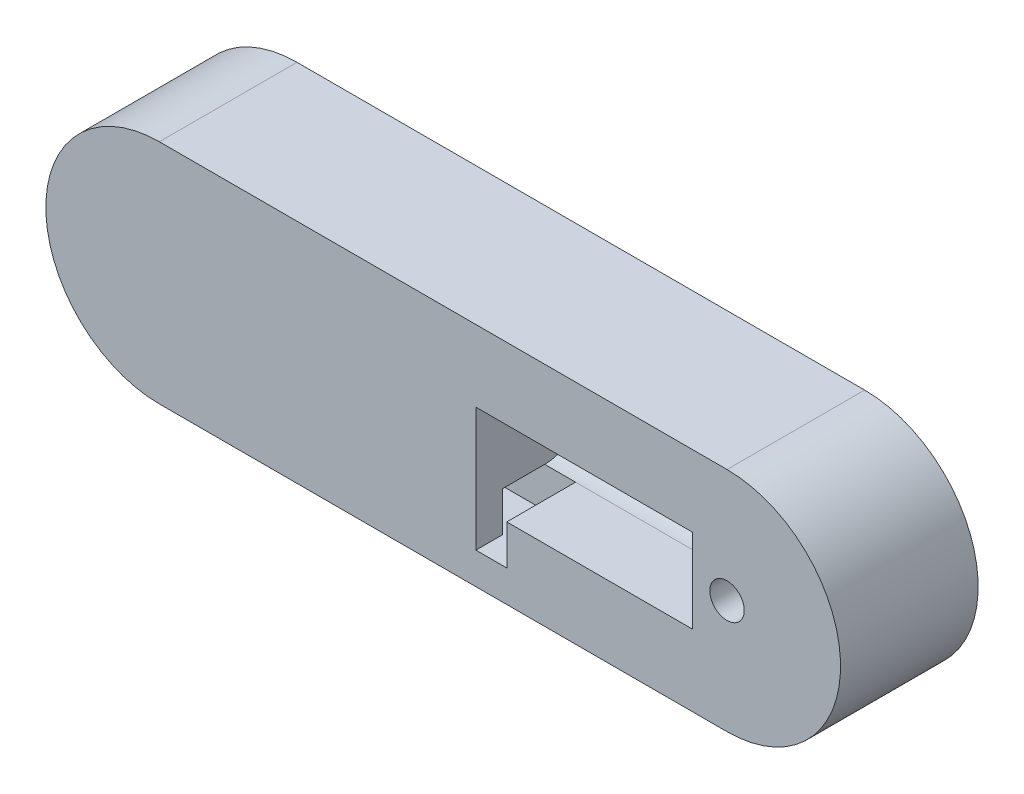
ISO-10303-21;
HEADER;
FILE_DESCRIPTION(('STEP AP214'),'2;1');
FILE_NAME('part.step','',(''),(''),'','','');
FILE_SCHEMA(('AUTOMOTIVE_DESIGN { 1 0 10303 214 1 1 1 1 }'));
ENDSEC;
DATA;
#1=APPLICATION_CONTEXT('core data for automotive mechanical design processes');
#2=APPLICATION_PROTOCOL_DEFINITION('international standard','automotive_design',2000,#1);
#3=PRODUCT_CONTEXT('',#1,'mechanical');
#4=PRODUCT('Part','Part','',(#3));
#5=PRODUCT_RELATED_PRODUCT_CATEGORY('part','',(#4));
#6=PRODUCT_DEFINITION_FORMATION('','',#4);
#7=PRODUCT_DEFINITION_CONTEXT('part definition',#1,'design');
#8=PRODUCT_DEFINITION('design','',#6,#7);
#9=PRODUCT_DEFINITION_SHAPE('','',#8);
#10=(LENGTH_UNIT() NAMED_UNIT(*) SI_UNIT(.MILLI.,.METRE.));
#11=(NAMED_UNIT(*) PLANE_ANGLE_UNIT() SI_UNIT($,.RADIAN.));
#12=(NAMED_UNIT(*) SI_UNIT($,.STERADIAN.) SOLID_ANGLE_UNIT());
#13=UNCERTAINTY_MEASURE_WITH_UNIT(LENGTH_MEASURE(1.E-05),#10,'distance_accuracy_value','');
#14=(GEOMETRIC_REPRESENTATION_CONTEXT(3) GLOBAL_UNCERTAINTY_ASSIGNED_CONTEXT((#13)) GLOBAL_UNIT_ASSIGNED_CONTEXT((#10,
#11,#12)) REPRESENTATION_CONTEXT('',''));
#15=CARTESIAN_POINT('',(0.,0.,0.));
#16=DIRECTION('',(0.,0.,1.));
#17=DIRECTION('',(1.,0.,0.));
#18=AXIS2_PLACEMENT_3D('',#15,#16,#17);
#19=CARTESIAN_POINT('',(0.,0.,20.));
#20=DIRECTION('',(0.,0.,1.));
#21=DIRECTION('',(1.,0.,0.));
#22=AXIS2_PLACEMENT_3D('',#19,#20,#21);
#23=PLANE('',#22);
#24=DIRECTION('',(1.,0.,0.));
#25=VECTOR('',#24,1.);
#26=CARTESIAN_POINT('',(-36.0271109618936,-12.2,20.));
#27=LINE('',#26,#25);
#28=CARTESIAN_POINT('',(-24.4271109618936,-12.2,20.));
#29=VERTEX_POINT('',#28);
#30=CARTESIAN_POINT('',(48.9728890381065,-12.2,20.));
#31=VERTEX_POINT('',#30);
#32=EDGE_CURVE('E247',#29,#31,#27,.T.);
#33=ORIENTED_EDGE('',*,*,#32,.F.);
#34=DIRECTION('',(0.,-1.,0.));
#35=VECTOR('',#34,1.);
#36=CARTESIAN_POINT('',(-24.4271109618936,-23.8,20.));
#37=LINE('',#36,#35);
#38=CARTESIAN_POINT('',(-24.4271109618936,-23.7999999999999,20.));
#39=VERTEX_POINT('',#38);
#40=EDGE_CURVE('E213',#29,#39,#37,.T.);
#41=ORIENTED_EDGE('',*,*,#40,.T.);
#42=DIRECTION('',(1.,0.,0.));
#43=VECTOR('',#42,1.);
#44=CARTESIAN_POINT('',(0.,-23.7999999999999,20.));
#45=LINE('',#44,#43);
#46=CARTESIAN_POINT('',(57.9484931674774,-23.8,20.));
#47=VERTEX_POINT('',#46);
#48=EDGE_CURVE('E209',#39,#47,#45,.T.);
#49=ORIENTED_EDGE('',*,*,#48,.T.);
#50=DIRECTION('',(0.,1.,0.));
#51=VECTOR('',#50,1.);
#52=CARTESIAN_POINT('',(57.9484931674774,0.,20.));
#53=LINE('',#52,#51);
#54=CARTESIAN_POINT('',(57.9484931674774,-12.2,20.));
#55=VERTEX_POINT('',#54);
#56=EDGE_CURVE('E329',#47,#55,#53,.T.);
#57=ORIENTED_EDGE('',*,*,#56,.T.);
#58=DIRECTION('',(-1.,0.,0.));
#59=VECTOR('',#58,1.);
#60=CARTESIAN_POINT('',(152.373384084578,-12.2,20.));
#61=LINE('',#60,#59);
#62=EDGE_CURVE('E449',#55,#31,#61,.T.);
#63=ORIENTED_EDGE('',*,*,#62,.T.);
#64=EDGE_LOOP('',(#33,#41,#49,#57,#63));
#65=FACE_BOUND('',#64,.T.);
#66=ADVANCED_FACE('F55',(#65),#23,.T.);
#67=CARTESIAN_POINT('',(48.9728890381065,0.,20.));
#68=DIRECTION('',(-1.,0.,0.));
#69=DIRECTION('',(0.,-1.,0.));
#70=AXIS2_PLACEMENT_3D('',#67,#68,#69);
#71=PLANE('',#70);
#72=DIRECTION('',(0.,0.,1.));
#73=VECTOR('',#72,1.);
#74=CARTESIAN_POINT('',(48.9728890381065,-12.2,0.));
#75=LINE('',#74,#73);
#76=CARTESIAN_POINT('',(48.9728890381065,-12.2,32.2));
#77=VERTEX_POINT('',#76);
#78=EDGE_CURVE('E216',#31,#77,#75,.T.);
#79=ORIENTED_EDGE('',*,*,#78,.F.);
#80=CARTESIAN_POINT('',(48.9728890381065,0.,20.));
#81=DIRECTION('',(1.,0.,0.));
#82=DIRECTION('',(0.,1.,0.));
#83=AXIS2_PLACEMENT_3D('',#80,#81,#82);
#84=CIRCLE('',#83,12.2);
#85=CARTESIAN_POINT('',(48.9728890381065,12.2,20.));
#86=VERTEX_POINT('',#85);
#87=EDGE_CURVE('E312',#31,#86,#84,.T.);
#88=ORIENTED_EDGE('',*,*,#87,.T.);
#89=DIRECTION('',(0.,0.,1.));
#90=VECTOR('',#89,1.);
#91=CARTESIAN_POINT('',(48.9728890381065,12.2,20.));
#92=LINE('',#91,#90);
#93=CARTESIAN_POINT('',(48.9728890381065,12.2,40.));
#94=VERTEX_POINT('',#93);
#95=EDGE_CURVE('E375',#86,#94,#92,.T.);
#96=ORIENTED_EDGE('',*,*,#95,.T.);
#97=DIRECTION('',(0.,-1.,0.));
#98=VECTOR('',#97,1.);
#99=CARTESIAN_POINT('',(48.9728890381065,0.,40.));
#100=LINE('',#99,#98);
#101=CARTESIAN_POINT('',(48.9728890381065,-23.8,40.));
#102=VERTEX_POINT('',#101);
#103=EDGE_CURVE('E344',#94,#102,#100,.T.);
#104=ORIENTED_EDGE('',*,*,#103,.T.);
#105=DIRECTION('',(0.,0.,1.));
#106=VECTOR('',#105,1.);
#107=CARTESIAN_POINT('',(48.9728890381065,-23.8,20.));
#108=LINE('',#107,#106);
#109=CARTESIAN_POINT('',(48.9728890381065,-23.8,32.2));
#110=VERTEX_POINT('',#109);
#111=EDGE_CURVE('E367',#110,#102,#108,.T.);
#112=ORIENTED_EDGE('',*,*,#111,.F.);
#113=DIRECTION('',(0.,-1.,0.));
#114=VECTOR('',#113,1.);
#115=CARTESIAN_POINT('',(48.9728890381065,0.,32.2));
#116=LINE('',#115,#114);
#117=EDGE_CURVE('E239',#77,#110,#116,.T.);
#118=ORIENTED_EDGE('',*,*,#117,.F.);
#119=EDGE_LOOP('',(#79,#88,#96,#104,#112,#118));
#120=FACE_BOUND('',#119,.T.);
#121=ADVANCED_FACE('F476',(#120),#71,.F.);
#122=CARTESIAN_POINT('',(121.972889038106,0.,40.));
#123=DIRECTION('',(0.,0.,-1.));
#124=DIRECTION('',(-1.,0.,0.));
#125=AXIS2_PLACEMENT_3D('',#122,#123,#124);
#126=CYLINDRICAL_SURFACE('',#125,4.99999999999999);
#127=CARTESIAN_POINT('',(121.972889038106,0.,0.));
#128=DIRECTION('',(0.,0.,1.));
#129=DIRECTION('',(1.,0.,0.));
#130=AXIS2_PLACEMENT_3D('',#127,#128,#129);
#131=CIRCLE('',#130,4.99999999999999);
#132=CARTESIAN_POINT('',(126.972889038106,0.,0.));
#133=VERTEX_POINT('',#132);
#134=EDGE_CURVE('E401',#133,#133,#131,.T.);
#135=ORIENTED_EDGE('',*,*,#134,.F.);
#136=EDGE_LOOP('',(#135));
#137=FACE_BOUND('',#136,.T.);
#138=CARTESIAN_POINT('',(121.972889038106,0.,7.80000000000001));
#139=DIRECTION('',(0.,0.,1.));
#140=DIRECTION('',(1.,0.,0.));
#141=AXIS2_PLACEMENT_3D('',#138,#139,#140);
#142=CIRCLE('',#141,4.99999999999999);
#143=CARTESIAN_POINT('',(126.972889038106,0.,7.80000000000001));
#144=VERTEX_POINT('',#143);
#145=EDGE_CURVE('E299',#144,#144,#142,.T.);
#146=ORIENTED_EDGE('',*,*,#145,.T.);
#147=EDGE_LOOP('',(#146));
#148=FACE_BOUND('',#147,.T.);
#149=ADVANCED_FACE('F547',(#137,#148),#126,.F.);
#150=CARTESIAN_POINT('',(111.972889038106,0.,20.));
#151=DIRECTION('',(1.,0.,0.));
#152=DIRECTION('',(0.,0.,-1.));
#153=AXIS2_PLACEMENT_3D('',#150,#151,#152);
#154=PLANE('',#153);
#155=DIRECTION('',(0.,1.,0.));
#156=VECTOR('',#155,1.);
#157=CARTESIAN_POINT('',(111.972889038106,0.,32.2));
#158=LINE('',#157,#156);
#159=CARTESIAN_POINT('',(111.972889038106,-12.2,32.2));
#160=VERTEX_POINT('',#159);
#161=CARTESIAN_POINT('',(111.972889038106,12.2,32.2));
#162=VERTEX_POINT('',#161);
#163=EDGE_CURVE('E284',#160,#162,#158,.T.);
#164=ORIENTED_EDGE('',*,*,#163,.F.);
#165=DIRECTION('',(0.,0.,1.));
#166=VECTOR('',#165,1.);
#167=CARTESIAN_POINT('',(111.972889038106,-12.2,20.));
#168=LINE('',#167,#166);
#169=CARTESIAN_POINT('',(111.972889038106,-12.2,40.));
#170=VERTEX_POINT('',#169);
#171=EDGE_CURVE('E360',#160,#170,#168,.T.);
#172=ORIENTED_EDGE('',*,*,#171,.T.);
#173=DIRECTION('',(0.,1.,0.));
#174=VECTOR('',#173,1.);
#175=CARTESIAN_POINT('',(111.972889038106,0.,40.));
#176=LINE('',#175,#174);
#177=CARTESIAN_POINT('',(111.972889038106,12.2,40.));
#178=VERTEX_POINT('',#177);
#179=EDGE_CURVE('E320',#170,#178,#176,.T.);
#180=ORIENTED_EDGE('',*,*,#179,.T.);
#181=DIRECTION('',(0.,0.,1.));
#182=VECTOR('',#181,1.);
#183=CARTESIAN_POINT('',(111.972889038106,12.2,20.));
#184=LINE('',#183,#182);
#185=EDGE_CURVE('E340',#162,#178,#184,.T.);
#186=ORIENTED_EDGE('',*,*,#185,.F.);
#187=EDGE_LOOP('',(#164,#172,#180,#186));
#188=FACE_BOUND('',#187,.T.);
#189=ADVANCED_FACE('F507',(#188),#154,.F.);
#190=CARTESIAN_POINT('',(0.,0.,0.));
#191=DIRECTION('',(0.,0.,1.));
#192=DIRECTION('',(1.,0.,0.));
#193=AXIS2_PLACEMENT_3D('',#190,#191,#192);
#194=PLANE('',#193);
#195=DIRECTION('',(1.,0.,0.));
#196=VECTOR('',#195,1.);
#197=CARTESIAN_POINT('',(-36.0271109618936,-12.2,0.));
#198=LINE('',#197,#196);
#199=CARTESIAN_POINT('',(-46.0271109618936,-12.2000000000001,0.));
#200=VERTEX_POINT('',#199);
#201=CARTESIAN_POINT('',(-24.4271109618936,-12.2,0.));
#202=VERTEX_POINT('',#201);
#203=EDGE_CURVE('E69',#200,#202,#198,.T.);
#204=ORIENTED_EDGE('',*,*,#203,.F.);
#205=DIRECTION('',(0.,-1.,0.));
#206=VECTOR('',#205,1.);
#207=CARTESIAN_POINT('',(-46.0271109618936,-23.8,0.));
#208=LINE('',#207,#206);
#209=CARTESIAN_POINT('',(-46.0271109618936,-23.8,0.));
#210=VERTEX_POINT('',#209);
#211=EDGE_CURVE('E223',#200,#210,#208,.T.);
#212=ORIENTED_EDGE('',*,*,#211,.T.);
#213=DIRECTION('',(-1.,0.,0.));
#214=VECTOR('',#213,1.);
#215=CARTESIAN_POINT('',(-24.4271109618936,-23.8,0.));
#216=LINE('',#215,#214);
#217=CARTESIAN_POINT('',(-24.4271109618936,-23.8,0.));
#218=VERTEX_POINT('',#217);
#219=EDGE_CURVE('E77',#218,#210,#216,.T.);
#220=ORIENTED_EDGE('',*,*,#219,.F.);
#221=DIRECTION('',(0.,-1.,0.));
#222=VECTOR('',#221,1.);
#223=CARTESIAN_POINT('',(-24.4271109618936,-23.8,0.));
#224=LINE('',#223,#222);
#225=EDGE_CURVE('E217',#202,#218,#224,.T.);
#226=ORIENTED_EDGE('',*,*,#225,.F.);
#227=EDGE_LOOP('',(#204,#212,#220,#226));
#228=FACE_BOUND('',#227,.T.);
#229=CARTESIAN_POINT('',(-43.0271109618936,0.,0.));
#230=DIRECTION('',(0.,0.,1.));
#231=DIRECTION('',(1.,0.,0.));
#232=AXIS2_PLACEMENT_3D('',#229,#230,#231);
#233=CIRCLE('',#232,33.);
#234=CARTESIAN_POINT('',(-43.0271109618936,33.,0.));
#235=VERTEX_POINT('',#234);
#236=CARTESIAN_POINT('',(-43.0271109618936,-33.,0.));
#237=VERTEX_POINT('',#236);
#238=EDGE_CURVE('E399',#235,#237,#233,.T.);
#239=ORIENTED_EDGE('',*,*,#238,.F.);
#240=DIRECTION('',(1.,0.,0.));
#241=VECTOR('',#240,1.);
#242=CARTESIAN_POINT('',(0.,33.,0.));
#243=LINE('',#242,#241);
#244=CARTESIAN_POINT('',(121.972889038106,33.,0.));
#245=VERTEX_POINT('',#244);
#246=EDGE_CURVE('E426',#235,#245,#243,.T.);
#247=ORIENTED_EDGE('',*,*,#246,.T.);
#248=CARTESIAN_POINT('',(121.972889038106,0.,0.));
#249=DIRECTION('',(0.,0.,1.));
#250=DIRECTION('',(1.,0.,0.));
#251=AXIS2_PLACEMENT_3D('',#248,#249,#250);
#252=CIRCLE('',#251,33.);
#253=CARTESIAN_POINT('',(121.972889038106,-33.,0.));
#254=VERTEX_POINT('',#253);
#255=EDGE_CURVE('E425',#254,#245,#252,.T.);
#256=ORIENTED_EDGE('',*,*,#255,.F.);
#257=DIRECTION('',(1.,0.,0.));
#258=VECTOR('',#257,1.);
#259=CARTESIAN_POINT('',(0.,-33.,0.));
#260=LINE('',#259,#258);
#261=EDGE_CURVE('E423',#237,#254,#260,.T.);
#262=ORIENTED_EDGE('',*,*,#261,.F.);
#263=EDGE_LOOP('',(#239,#247,#256,#262));
#264=FACE_BOUND('',#263,.T.);
#265=ORIENTED_EDGE('',*,*,#134,.T.);
#266=EDGE_LOOP('',(#265));
#267=FACE_BOUND('',#266,.T.);
#268=CARTESIAN_POINT('',(-43.0271109618936,0.,0.));
#269=DIRECTION('',(0.,0.,1.));
#270=DIRECTION('',(1.,0.,0.));
#271=AXIS2_PLACEMENT_3D('',#268,#269,#270);
#272=CIRCLE('',#271,2.);
#273=CARTESIAN_POINT('',(-41.5098899591176,1.3030888030888,0.));
#274=VERTEX_POINT('',#273);
#275=CARTESIAN_POINT('',(-41.5098899591176,-1.3030888030888,0.));
#276=VERTEX_POINT('',#275);
#277=EDGE_CURVE('E385',#274,#276,#272,.T.);
#278=ORIENTED_EDGE('',*,*,#277,.T.);
#279=DIRECTION('',(0.,-1.,0.));
#280=VECTOR('',#279,1.);
#281=CARTESIAN_POINT('',(-41.5098899591176,0.,0.));
#282=LINE('',#281,#280);
#283=EDGE_CURVE('E365',#274,#276,#282,.T.);
#284=ORIENTED_EDGE('',*,*,#283,.F.);
#285=EDGE_LOOP('',(#278,#284));
#286=FACE_BOUND('',#285,.T.);
#287=ADVANCED_FACE('F224',(#228,#264,#267,#286),#194,.F.);
#288=CARTESIAN_POINT('',(-43.0271109618936,0.,40.));
#289=DIRECTION('',(0.,0.,-1.));
#290=DIRECTION('',(-1.,0.,0.));
#291=AXIS2_PLACEMENT_3D('',#288,#289,#290);
#292=CYLINDRICAL_SURFACE('',#291,33.);
#293=ORIENTED_EDGE('',*,*,#238,.T.);
#294=DIRECTION('',(0.,0.,-1.));
#295=VECTOR('',#294,1.);
#296=CARTESIAN_POINT('',(-43.0271109618936,-33.,40.));
#297=LINE('',#296,#295);
#298=CARTESIAN_POINT('',(-43.0271109618936,-33.,40.));
#299=VERTEX_POINT('',#298);
#300=EDGE_CURVE('E443',#299,#237,#297,.T.);
#301=ORIENTED_EDGE('',*,*,#300,.F.);
#302=CARTESIAN_POINT('',(-43.0271109618936,0.,40.));
#303=DIRECTION('',(0.,0.,1.));
#304=DIRECTION('',(1.,0.,0.));
#305=AXIS2_PLACEMENT_3D('',#302,#303,#304);
#306=CIRCLE('',#305,33.);
#307=CARTESIAN_POINT('',(-43.0271109618936,33.,40.));
#308=VERTEX_POINT('',#307);
#309=EDGE_CURVE('E400',#308,#299,#306,.T.);
#310=ORIENTED_EDGE('',*,*,#309,.F.);
#311=DIRECTION('',(0.,0.,-1.));
#312=VECTOR('',#311,1.);
#313=CARTESIAN_POINT('',(-43.0271109618936,33.,40.));
#314=LINE('',#313,#312);
#315=EDGE_CURVE('E419',#308,#235,#314,.T.);
#316=ORIENTED_EDGE('',*,*,#315,.T.);
#317=EDGE_LOOP('',(#293,#301,#310,#316));
#318=FACE_BOUND('',#317,.T.);
#319=ADVANCED_FACE('F577',(#318),#292,.T.);
#320=CARTESIAN_POINT('',(0.,-33.,40.));
#321=DIRECTION('',(0.,1.,0.));
#322=DIRECTION('',(0.,0.,1.));
#323=AXIS2_PLACEMENT_3D('',#320,#321,#322);
#324=PLANE('',#323);
#325=ORIENTED_EDGE('',*,*,#261,.T.);
#326=DIRECTION('',(0.,0.,-1.));
#327=VECTOR('',#326,1.);
#328=CARTESIAN_POINT('',(121.972889038106,-33.,40.));
#329=LINE('',#328,#327);
#330=CARTESIAN_POINT('',(121.972889038106,-33.,40.));
#331=VERTEX_POINT('',#330);
#332=EDGE_CURVE('E439',#331,#254,#329,.T.);
#333=ORIENTED_EDGE('',*,*,#332,.F.);
#334=DIRECTION('',(1.,0.,0.));
#335=VECTOR('',#334,1.);
#336=CARTESIAN_POINT('',(0.,-33.,40.));
#337=LINE('',#336,#335);
#338=EDGE_CURVE('E405',#299,#331,#337,.T.);
#339=ORIENTED_EDGE('',*,*,#338,.F.);
#340=ORIENTED_EDGE('',*,*,#300,.T.);
#341=EDGE_LOOP('',(#325,#333,#339,#340));
#342=FACE_BOUND('',#341,.T.);
#343=ADVANCED_FACE('F590',(#342),#324,.F.);
#344=CARTESIAN_POINT('',(121.972889038106,0.,40.));
#345=DIRECTION('',(0.,0.,-1.));
#346=DIRECTION('',(-1.,0.,0.));
#347=AXIS2_PLACEMENT_3D('',#344,#345,#346);
#348=CYLINDRICAL_SURFACE('',#347,33.);
#349=ORIENTED_EDGE('',*,*,#255,.T.);
#350=DIRECTION('',(0.,0.,-1.));
#351=VECTOR('',#350,1.);
#352=CARTESIAN_POINT('',(121.972889038106,33.,40.));
#353=LINE('',#352,#351);
#354=CARTESIAN_POINT('',(121.972889038106,33.,40.));
#355=VERTEX_POINT('',#354);
#356=EDGE_CURVE('E440',#355,#245,#353,.T.);
#357=ORIENTED_EDGE('',*,*,#356,.F.);
#358=CARTESIAN_POINT('',(121.972889038106,0.,40.));
#359=DIRECTION('',(0.,0.,1.));
#360=DIRECTION('',(1.,0.,0.));
#361=AXIS2_PLACEMENT_3D('',#358,#359,#360);
#362=CIRCLE('',#361,33.);
#363=EDGE_CURVE('E406',#331,#355,#362,.T.);
#364=ORIENTED_EDGE('',*,*,#363,.F.);
#365=ORIENTED_EDGE('',*,*,#332,.T.);
#366=EDGE_LOOP('',(#349,#357,#364,#365));
#367=FACE_BOUND('',#366,.T.);
#368=ADVANCED_FACE('F582',(#367),#348,.T.);
#369=CARTESIAN_POINT('',(0.,33.,40.));
#370=DIRECTION('',(0.,1.,0.));
#371=DIRECTION('',(0.,0.,1.));
#372=AXIS2_PLACEMENT_3D('',#369,#370,#371);
#373=PLANE('',#372);
#374=ORIENTED_EDGE('',*,*,#246,.F.);
#375=ORIENTED_EDGE('',*,*,#315,.F.);
#376=DIRECTION('',(1.,0.,0.));
#377=VECTOR('',#376,1.);
#378=CARTESIAN_POINT('',(0.,33.,40.));
#379=LINE('',#378,#377);
#380=EDGE_CURVE('E408',#308,#355,#379,.T.);
#381=ORIENTED_EDGE('',*,*,#380,.T.);
#382=ORIENTED_EDGE('',*,*,#356,.T.);
#383=EDGE_LOOP('',(#374,#375,#381,#382));
#384=FACE_BOUND('',#383,.T.);
#385=ADVANCED_FACE('F576',(#384),#373,.T.);
#386=CARTESIAN_POINT('',(121.972889038106,0.,32.2));
#387=DIRECTION('',(0.,0.,1.));
#388=DIRECTION('',(1.,0.,0.));
#389=AXIS2_PLACEMENT_3D('',#386,#387,#388);
#390=CIRCLE('',#389,4.99999999999999);
#391=CARTESIAN_POINT('',(126.972889038106,0.,32.2));
#392=VERTEX_POINT('',#391);
#393=EDGE_CURVE('E315',#392,#392,#390,.T.);
#394=ORIENTED_EDGE('',*,*,#393,.F.);
#395=EDGE_LOOP('',(#394));
#396=FACE_BOUND('',#395,.T.);
#397=CARTESIAN_POINT('',(121.972889038106,0.,40.));
#398=DIRECTION('',(0.,0.,1.));
#399=DIRECTION('',(1.,0.,0.));
#400=AXIS2_PLACEMENT_3D('',#397,#398,#399);
#401=CIRCLE('',#400,4.99999999999999);
#402=CARTESIAN_POINT('',(126.972889038106,0.,40.));
#403=VERTEX_POINT('',#402);
#404=EDGE_CURVE('E413',#403,#403,#401,.T.);
#405=ORIENTED_EDGE('',*,*,#404,.T.);
#406=EDGE_LOOP('',(#405));
#407=FACE_BOUND('',#406,.T.);
#408=ADVANCED_FACE('F572',(#396,#407),#126,.F.);
#409=CARTESIAN_POINT('',(0.,0.,40.));
#410=DIRECTION('',(0.,0.,1.));
#411=DIRECTION('',(1.,0.,0.));
#412=AXIS2_PLACEMENT_3D('',#409,#410,#411);
#413=PLANE('',#412);
#414=ORIENTED_EDGE('',*,*,#179,.F.);
#415=DIRECTION('',(1.,0.,0.));
#416=VECTOR('',#415,1.);
#417=CARTESIAN_POINT('',(0.,-12.2,40.));
#418=LINE('',#417,#416);
#419=CARTESIAN_POINT('',(57.9484931674774,-12.2,40.));
#420=VERTEX_POINT('',#419);
#421=EDGE_CURVE('E327',#420,#170,#418,.T.);
#422=ORIENTED_EDGE('',*,*,#421,.F.);
#423=DIRECTION('',(0.,1.,0.));
#424=VECTOR('',#423,1.);
#425=CARTESIAN_POINT('',(57.9484931674774,0.,40.));
#426=LINE('',#425,#424);
#427=CARTESIAN_POINT('',(57.9484931674774,-23.8,40.));
#428=VERTEX_POINT('',#427);
#429=EDGE_CURVE('E354',#428,#420,#426,.T.);
#430=ORIENTED_EDGE('',*,*,#429,.F.);
#431=DIRECTION('',(1.,0.,0.));
#432=VECTOR('',#431,1.);
#433=CARTESIAN_POINT('',(0.,-23.7999999999999,40.));
#434=LINE('',#433,#432);
#435=EDGE_CURVE('E349',#102,#428,#434,.T.);
#436=ORIENTED_EDGE('',*,*,#435,.F.);
#437=ORIENTED_EDGE('',*,*,#103,.F.);
#438=DIRECTION('',(-1.,0.,0.));
#439=VECTOR('',#438,1.);
#440=CARTESIAN_POINT('',(0.,12.2,40.));
#441=LINE('',#440,#439);
#442=EDGE_CURVE('E341',#178,#94,#441,.T.);
#443=ORIENTED_EDGE('',*,*,#442,.F.);
#444=EDGE_LOOP('',(#414,#422,#430,#436,#437,#443));
#445=FACE_BOUND('',#444,.T.);
#446=ORIENTED_EDGE('',*,*,#309,.T.);
#447=ORIENTED_EDGE('',*,*,#338,.T.);
#448=ORIENTED_EDGE('',*,*,#363,.T.);
#449=ORIENTED_EDGE('',*,*,#380,.F.);
#450=EDGE_LOOP('',(#446,#447,#448,#449));
#451=FACE_BOUND('',#450,.T.);
#452=ORIENTED_EDGE('',*,*,#404,.F.);
#453=EDGE_LOOP('',(#452));
#454=FACE_BOUND('',#453,.T.);
#455=ADVANCED_FACE('F483',(#445,#451,#454),#413,.T.);
#456=CARTESIAN_POINT('',(-41.5098899591176,0.,10.));
#457=DIRECTION('',(1.,0.,0.));
#458=DIRECTION('',(0.,0.,-1.));
#459=AXIS2_PLACEMENT_3D('',#456,#457,#458);
#460=PLANE('',#459);
#461=ORIENTED_EDGE('',*,*,#283,.T.);
#462=DIRECTION('',(0.,0.,-1.));
#463=VECTOR('',#462,1.);
#464=CARTESIAN_POINT('',(-41.5098899591176,-1.3030888030888,10.));
#465=LINE('',#464,#463);
#466=CARTESIAN_POINT('',(-41.5098899591176,-1.3030888030888,10.));
#467=VERTEX_POINT('',#466);
#468=EDGE_CURVE('E383',#467,#276,#465,.T.);
#469=ORIENTED_EDGE('',*,*,#468,.F.);
#470=DIRECTION('',(0.,-1.,0.));
#471=VECTOR('',#470,1.);
#472=CARTESIAN_POINT('',(-41.5098899591176,0.,10.));
#473=LINE('',#472,#471);
#474=CARTESIAN_POINT('',(-41.5098899591176,1.3030888030888,10.));
#475=VERTEX_POINT('',#474);
#476=EDGE_CURVE('E380',#475,#467,#473,.T.);
#477=ORIENTED_EDGE('',*,*,#476,.F.);
#478=DIRECTION('',(0.,0.,-1.));
#479=VECTOR('',#478,1.);
#480=CARTESIAN_POINT('',(-41.5098899591176,1.3030888030888,10.));
#481=LINE('',#480,#479);
#482=EDGE_CURVE('E394',#475,#274,#481,.T.);
#483=ORIENTED_EDGE('',*,*,#482,.T.);
#484=EDGE_LOOP('',(#461,#469,#477,#483));
#485=FACE_BOUND('',#484,.T.);
#486=ADVANCED_FACE('F566',(#485),#460,.F.);
#487=CARTESIAN_POINT('',(-43.0271109618936,0.,10.));
#488=DIRECTION('',(0.,0.,-1.));
#489=DIRECTION('',(-1.,0.,0.));
#490=AXIS2_PLACEMENT_3D('',#487,#488,#489);
#491=CYLINDRICAL_SURFACE('',#490,2.);
#492=ORIENTED_EDGE('',*,*,#277,.F.);
#493=ORIENTED_EDGE('',*,*,#482,.F.);
#494=CARTESIAN_POINT('',(-43.0271109618936,0.,10.));
#495=DIRECTION('',(0.,0.,1.));
#496=DIRECTION('',(1.,0.,0.));
#497=AXIS2_PLACEMENT_3D('',#494,#495,#496);
#498=CIRCLE('',#497,2.);
#499=EDGE_CURVE('E382',#475,#467,#498,.T.);
#500=ORIENTED_EDGE('',*,*,#499,.T.);
#501=ORIENTED_EDGE('',*,*,#468,.T.);
#502=EDGE_LOOP('',(#492,#493,#500,#501));
#503=FACE_BOUND('',#502,.T.);
#504=ADVANCED_FACE('F565',(#503),#491,.F.);
#505=CARTESIAN_POINT('',(0.,0.,10.));
#506=DIRECTION('',(0.,0.,1.));
#507=DIRECTION('',(1.,0.,0.));
#508=AXIS2_PLACEMENT_3D('',#505,#506,#507);
#509=PLANE('',#508);
#510=ORIENTED_EDGE('',*,*,#476,.T.);
#511=ORIENTED_EDGE('',*,*,#499,.F.);
#512=EDGE_LOOP('',(#510,#511));
#513=FACE_BOUND('',#512,.T.);
#514=ADVANCED_FACE('F552',(#513),#509,.F.);
#515=CARTESIAN_POINT('',(0.,-12.2,20.));
#516=DIRECTION('',(0.,-1.,0.));
#517=DIRECTION('',(0.,0.,-1.));
#518=AXIS2_PLACEMENT_3D('',#515,#516,#517);
#519=PLANE('',#518);
#520=ORIENTED_EDGE('',*,*,#421,.T.);
#521=ORIENTED_EDGE('',*,*,#171,.F.);
#522=DIRECTION('',(-1.,0.,0.));
#523=VECTOR('',#522,1.);
#524=CARTESIAN_POINT('',(141.972889038106,-12.2,32.2));
#525=LINE('',#524,#523);
#526=CARTESIAN_POINT('',(141.972889038106,-12.2,32.2));
#527=VERTEX_POINT('',#526);
#528=EDGE_CURVE('E279',#527,#160,#525,.T.);
#529=ORIENTED_EDGE('',*,*,#528,.F.);
#530=DIRECTION('',(0.,0.,1.));
#531=VECTOR('',#530,1.);
#532=CARTESIAN_POINT('',(141.972889038106,-12.2,0.));
#533=LINE('',#532,#531);
#534=CARTESIAN_POINT('',(141.972889038106,-12.2,7.80000000000001));
#535=VERTEX_POINT('',#534);
#536=EDGE_CURVE('E264',#535,#527,#533,.T.);
#537=ORIENTED_EDGE('',*,*,#536,.F.);
#538=DIRECTION('',(-1.,0.,0.));
#539=VECTOR('',#538,1.);
#540=CARTESIAN_POINT('',(141.972889038106,-12.2,7.80000000000001));
#541=LINE('',#540,#539);
#542=CARTESIAN_POINT('',(111.972889038106,-12.2,7.80000000000001));
#543=VERTEX_POINT('',#542);
#544=EDGE_CURVE('E298',#535,#543,#541,.T.);
#545=ORIENTED_EDGE('',*,*,#544,.T.);
#546=DIRECTION('',(0.,0.,1.));
#547=VECTOR('',#546,1.);
#548=CARTESIAN_POINT('',(111.972889038106,-12.2,0.));
#549=LINE('',#548,#547);
#550=CARTESIAN_POINT('',(111.972889038106,-12.2,20.));
#551=VERTEX_POINT('',#550);
#552=EDGE_CURVE('E260',#543,#551,#549,.T.);
#553=ORIENTED_EDGE('',*,*,#552,.T.);
#554=DIRECTION('',(1.,0.,0.));
#555=VECTOR('',#554,1.);
#556=CARTESIAN_POINT('',(0.,-12.2,20.));
#557=LINE('',#556,#555);
#558=EDGE_CURVE('E335',#55,#551,#557,.T.);
#559=ORIENTED_EDGE('',*,*,#558,.F.);
#560=DIRECTION('',(0.,0.,1.));
#561=VECTOR('',#560,1.);
#562=CARTESIAN_POINT('',(57.9484931674774,-12.2,20.));
#563=LINE('',#562,#561);
#564=EDGE_CURVE('E361',#55,#420,#563,.T.);
#565=ORIENTED_EDGE('',*,*,#564,.T.);
#566=EDGE_LOOP('',(#520,#521,#529,#537,#545,#553,#559,#565));
#567=FACE_BOUND('',#566,.T.);
#568=ADVANCED_FACE('F496',(#567),#519,.F.);
#569=CARTESIAN_POINT('',(57.9484931674774,0.,20.));
#570=DIRECTION('',(1.,0.,0.));
#571=DIRECTION('',(0.,1.,0.));
#572=AXIS2_PLACEMENT_3D('',#569,#570,#571);
#573=PLANE('',#572);
#574=ORIENTED_EDGE('',*,*,#429,.T.);
#575=ORIENTED_EDGE('',*,*,#564,.F.);
#576=ORIENTED_EDGE('',*,*,#56,.F.);
#577=DIRECTION('',(0.,0.,1.));
#578=VECTOR('',#577,1.);
#579=CARTESIAN_POINT('',(57.9484931674774,-23.8,20.));
#580=LINE('',#579,#578);
#581=EDGE_CURVE('E366',#47,#428,#580,.T.);
#582=ORIENTED_EDGE('',*,*,#581,.T.);
#583=EDGE_LOOP('',(#574,#575,#576,#582));
#584=FACE_BOUND('',#583,.T.);
#585=ADVANCED_FACE('F489',(#584),#573,.F.);
#586=CARTESIAN_POINT('',(0.,-23.7999999999999,20.));
#587=DIRECTION('',(0.,-1.,0.));
#588=DIRECTION('',(1.,0.,0.));
#589=AXIS2_PLACEMENT_3D('',#586,#587,#588);
#590=PLANE('',#589);
#591=ORIENTED_EDGE('',*,*,#435,.T.);
#592=ORIENTED_EDGE('',*,*,#581,.F.);
#593=ORIENTED_EDGE('',*,*,#48,.F.);
#594=DIRECTION('',(0.,0.,-1.));
#595=VECTOR('',#594,1.);
#596=CARTESIAN_POINT('',(-24.4271109618936,-23.8,40.001));
#597=LINE('',#596,#595);
#598=EDGE_CURVE('E201',#39,#218,#597,.T.);
#599=ORIENTED_EDGE('',*,*,#598,.T.);
#600=ORIENTED_EDGE('',*,*,#219,.T.);
#601=DIRECTION('',(0.70710678118655,0.,0.707106781186546));
#602=VECTOR('',#601,1.);
#603=CARTESIAN_POINT('',(-13.0135554809467,-23.7999999999999,33.0135554809467));
#604=LINE('',#603,#602);
#605=CARTESIAN_POINT('',(-36.0271109618935,-23.8,9.99999999999998));
#606=VERTEX_POINT('',#605);
#607=EDGE_CURVE('E12',#210,#606,#604,.T.);
#608=ORIENTED_EDGE('',*,*,#607,.T.);
#609=DIRECTION('',(0.,0.,-1.));
#610=VECTOR('',#609,1.);
#611=CARTESIAN_POINT('',(-36.0271109618935,-23.8,0.));
#612=LINE('',#611,#610);
#613=CARTESIAN_POINT('',(-36.0271109618935,-23.8,32.2));
#614=VERTEX_POINT('',#613);
#615=EDGE_CURVE('E242',#614,#606,#612,.T.);
#616=ORIENTED_EDGE('',*,*,#615,.F.);
#617=DIRECTION('',(1.,0.,0.));
#618=VECTOR('',#617,1.);
#619=CARTESIAN_POINT('',(-36.0271109618935,-23.8,32.2));
#620=LINE('',#619,#618);
#621=EDGE_CURVE('E251',#614,#110,#620,.T.);
#622=ORIENTED_EDGE('',*,*,#621,.T.);
#623=ORIENTED_EDGE('',*,*,#111,.T.);
#624=EDGE_LOOP('',(#591,#592,#593,#599,#600,#608,#616,#622,#623));
#625=FACE_BOUND('',#624,.T.);
#626=ADVANCED_FACE('F210',(#625),#590,.F.);
#627=CARTESIAN_POINT('',(0.,12.2,20.));
#628=DIRECTION('',(0.,1.,0.));
#629=DIRECTION('',(0.,0.,1.));
#630=AXIS2_PLACEMENT_3D('',#627,#628,#629);
#631=PLANE('',#630);
#632=ORIENTED_EDGE('',*,*,#442,.T.);
#633=ORIENTED_EDGE('',*,*,#95,.F.);
#634=DIRECTION('',(-1.,0.,0.));
#635=VECTOR('',#634,1.);
#636=CARTESIAN_POINT('',(0.,12.2,20.));
#637=LINE('',#636,#635);
#638=CARTESIAN_POINT('',(111.972889038106,12.2,20.));
#639=VERTEX_POINT('',#638);
#640=EDGE_CURVE('E322',#639,#86,#637,.T.);
#641=ORIENTED_EDGE('',*,*,#640,.F.);
#642=DIRECTION('',(0.,0.,-1.));
#643=VECTOR('',#642,1.);
#644=CARTESIAN_POINT('',(111.972889038106,12.2,0.));
#645=LINE('',#644,#643);
#646=CARTESIAN_POINT('',(111.972889038106,12.2,7.80000000000001));
#647=VERTEX_POINT('',#646);
#648=EDGE_CURVE('E290',#639,#647,#645,.T.);
#649=ORIENTED_EDGE('',*,*,#648,.T.);
#650=DIRECTION('',(-1.,0.,0.));
#651=VECTOR('',#650,1.);
#652=CARTESIAN_POINT('',(141.972889038106,12.2,7.80000000000001));
#653=LINE('',#652,#651);
#654=CARTESIAN_POINT('',(141.972889038106,12.2,7.80000000000001));
#655=VERTEX_POINT('',#654);
#656=EDGE_CURVE('E297',#655,#647,#653,.T.);
#657=ORIENTED_EDGE('',*,*,#656,.F.);
#658=DIRECTION('',(0.,0.,-1.));
#659=VECTOR('',#658,1.);
#660=CARTESIAN_POINT('',(141.972889038106,12.2,0.));
#661=LINE('',#660,#659);
#662=CARTESIAN_POINT('',(141.972889038106,12.2,32.2));
#663=VERTEX_POINT('',#662);
#664=EDGE_CURVE('E271',#663,#655,#661,.T.);
#665=ORIENTED_EDGE('',*,*,#664,.F.);
#666=DIRECTION('',(-1.,0.,0.));
#667=VECTOR('',#666,1.);
#668=CARTESIAN_POINT('',(141.972889038106,12.2,32.2));
#669=LINE('',#668,#667);
#670=EDGE_CURVE('E302',#663,#162,#669,.T.);
#671=ORIENTED_EDGE('',*,*,#670,.T.);
#672=ORIENTED_EDGE('',*,*,#185,.T.);
#673=EDGE_LOOP('',(#632,#633,#641,#649,#657,#665,#671,#672));
#674=FACE_BOUND('',#673,.T.);
#675=ADVANCED_FACE('F502',(#674),#631,.F.);
#676=CARTESIAN_POINT('',(152.373384084578,0.,20.));
#677=DIRECTION('',(-1.,0.,0.));
#678=DIRECTION('',(0.,0.,1.));
#679=AXIS2_PLACEMENT_3D('',#676,#677,#678);
#680=CYLINDRICAL_SURFACE('',#679,12.2);
#681=CARTESIAN_POINT('',(111.972889038106,0.,20.));
#682=DIRECTION('',(1.,0.,0.));
#683=DIRECTION('',(0.,0.,-1.));
#684=AXIS2_PLACEMENT_3D('',#681,#682,#683);
#685=CIRCLE('',#684,12.2);
#686=CARTESIAN_POINT('',(111.972889038106,0.,7.80000000000001));
#687=VERTEX_POINT('',#686);
#688=EDGE_CURVE('E319',#551,#687,#685,.T.);
#689=ORIENTED_EDGE('',*,*,#688,.T.);
#690=EDGE_CURVE('E325',#687,#639,#685,.T.);
#691=ORIENTED_EDGE('',*,*,#690,.T.);
#692=ORIENTED_EDGE('',*,*,#640,.T.);
#693=ORIENTED_EDGE('',*,*,#87,.F.);
#694=ORIENTED_EDGE('',*,*,#62,.F.);
#695=ORIENTED_EDGE('',*,*,#558,.T.);
#696=EDGE_LOOP('',(#689,#691,#692,#693,#694,#695));
#697=FACE_BOUND('',#696,.T.);
#698=ADVANCED_FACE('F497',(#697),#680,.F.);
#699=CARTESIAN_POINT('',(111.972889038106,0.,0.));
#700=DIRECTION('',(-1.,0.,0.));
#701=DIRECTION('',(0.,0.,1.));
#702=AXIS2_PLACEMENT_3D('',#699,#700,#701);
#703=PLANE('',#702);
#704=ORIENTED_EDGE('',*,*,#552,.F.);
#705=DIRECTION('',(0.,1.,0.));
#706=VECTOR('',#705,1.);
#707=CARTESIAN_POINT('',(111.972889038106,0.,7.80000000000001));
#708=LINE('',#707,#706);
#709=EDGE_CURVE('E266',#543,#687,#708,.T.);
#710=ORIENTED_EDGE('',*,*,#709,.T.);
#711=ORIENTED_EDGE('',*,*,#688,.F.);
#712=EDGE_LOOP('',(#704,#710,#711));
#713=FACE_BOUND('',#712,.T.);
#714=ADVANCED_FACE('F530',(#713),#703,.F.);
#715=EDGE_CURVE('E292',#687,#647,#708,.T.);
#716=ORIENTED_EDGE('',*,*,#715,.T.);
#717=ORIENTED_EDGE('',*,*,#648,.F.);
#718=ORIENTED_EDGE('',*,*,#690,.F.);
#719=EDGE_LOOP('',(#716,#717,#718));
#720=FACE_BOUND('',#719,.T.);
#721=ADVANCED_FACE('F524',(#720),#703,.F.);
#722=CARTESIAN_POINT('',(141.972889038106,0.,7.80000000000001));
#723=DIRECTION('',(0.,0.,1.));
#724=DIRECTION('',(1.,0.,0.));
#725=AXIS2_PLACEMENT_3D('',#722,#723,#724);
#726=PLANE('',#725);
#727=ORIENTED_EDGE('',*,*,#145,.F.);
#728=EDGE_LOOP('',(#727));
#729=FACE_BOUND('',#728,.T.);
#730=ORIENTED_EDGE('',*,*,#709,.F.);
#731=ORIENTED_EDGE('',*,*,#544,.F.);
#732=DIRECTION('',(0.,1.,0.));
#733=VECTOR('',#732,1.);
#734=CARTESIAN_POINT('',(141.972889038106,0.,7.80000000000001));
#735=LINE('',#734,#733);
#736=EDGE_CURVE('E280',#535,#655,#735,.T.);
#737=ORIENTED_EDGE('',*,*,#736,.T.);
#738=ORIENTED_EDGE('',*,*,#656,.T.);
#739=ORIENTED_EDGE('',*,*,#715,.F.);
#740=EDGE_LOOP('',(#730,#731,#737,#738,#739));
#741=FACE_BOUND('',#740,.T.);
#742=ADVANCED_FACE('F522',(#729,#741),#726,.T.);
#743=CARTESIAN_POINT('',(141.972889038106,0.,32.2));
#744=DIRECTION('',(0.,0.,1.));
#745=DIRECTION('',(1.,0.,0.));
#746=AXIS2_PLACEMENT_3D('',#743,#744,#745);
#747=PLANE('',#746);
#748=ORIENTED_EDGE('',*,*,#393,.T.);
#749=EDGE_LOOP('',(#748));
#750=FACE_BOUND('',#749,.T.);
#751=ORIENTED_EDGE('',*,*,#163,.T.);
#752=ORIENTED_EDGE('',*,*,#670,.F.);
#753=DIRECTION('',(0.,1.,0.));
#754=VECTOR('',#753,1.);
#755=CARTESIAN_POINT('',(141.972889038106,0.,32.2));
#756=LINE('',#755,#754);
#757=EDGE_CURVE('E270',#527,#663,#756,.T.);
#758=ORIENTED_EDGE('',*,*,#757,.F.);
#759=ORIENTED_EDGE('',*,*,#528,.T.);
#760=EDGE_LOOP('',(#751,#752,#758,#759));
#761=FACE_BOUND('',#760,.T.);
#762=ADVANCED_FACE('F514',(#750,#761),#747,.F.);
#763=CARTESIAN_POINT('',(141.972889038106,0.,0.));
#764=DIRECTION('',(-1.,0.,0.));
#765=DIRECTION('',(0.,0.,1.));
#766=AXIS2_PLACEMENT_3D('',#763,#764,#765);
#767=PLANE('',#766);
#768=ORIENTED_EDGE('',*,*,#536,.T.);
#769=ORIENTED_EDGE('',*,*,#757,.T.);
#770=ORIENTED_EDGE('',*,*,#664,.T.);
#771=ORIENTED_EDGE('',*,*,#736,.F.);
#772=EDGE_LOOP('',(#768,#769,#770,#771));
#773=FACE_BOUND('',#772,.T.);
#774=ADVANCED_FACE('F520',(#773),#767,.T.);
#775=CARTESIAN_POINT('',(-36.0271109618936,0.,32.2));
#776=DIRECTION('',(0.,0.,1.));
#777=DIRECTION('',(1.,0.,0.));
#778=AXIS2_PLACEMENT_3D('',#775,#776,#777);
#779=PLANE('',#778);
#780=ORIENTED_EDGE('',*,*,#117,.T.);
#781=ORIENTED_EDGE('',*,*,#621,.F.);
#782=DIRECTION('',(0.,-1.,0.));
#783=VECTOR('',#782,1.);
#784=CARTESIAN_POINT('',(-36.0271109618936,0.,32.2));
#785=LINE('',#784,#783);
#786=CARTESIAN_POINT('',(-36.0271109618936,-12.2,32.2));
#787=VERTEX_POINT('',#786);
#788=EDGE_CURVE('E237',#787,#614,#785,.T.);
#789=ORIENTED_EDGE('',*,*,#788,.F.);
#790=DIRECTION('',(1.,0.,0.));
#791=VECTOR('',#790,1.);
#792=CARTESIAN_POINT('',(-36.0271109618936,-12.2,32.2));
#793=LINE('',#792,#791);
#794=EDGE_CURVE('E257',#787,#77,#793,.T.);
#795=ORIENTED_EDGE('',*,*,#794,.T.);
#796=EDGE_LOOP('',(#780,#781,#789,#795));
#797=FACE_BOUND('',#796,.T.);
#798=ADVANCED_FACE('F475',(#797),#779,.F.);
#799=CARTESIAN_POINT('',(-36.0271109618936,-12.2,0.));
#800=DIRECTION('',(0.,1.,0.));
#801=DIRECTION('',(0.,0.,1.));
#802=AXIS2_PLACEMENT_3D('',#799,#800,#801);
#803=PLANE('',#802);
#804=ORIENTED_EDGE('',*,*,#78,.T.);
#805=ORIENTED_EDGE('',*,*,#794,.F.);
#806=DIRECTION('',(0.,0.,1.));
#807=VECTOR('',#806,1.);
#808=CARTESIAN_POINT('',(-36.0271109618936,-12.2,0.));
#809=LINE('',#808,#807);
#810=CARTESIAN_POINT('',(-36.0271109618936,-12.2,9.99999999999998));
#811=VERTEX_POINT('',#810);
#812=EDGE_CURVE('E236',#811,#787,#809,.T.);
#813=ORIENTED_EDGE('',*,*,#812,.F.);
#814=DIRECTION('',(-0.70710678118655,0.,-0.707106781186546));
#815=VECTOR('',#814,1.);
#816=CARTESIAN_POINT('',(-41.0271109618935,-12.2,5.00000000000001));
#817=LINE('',#816,#815);
#818=EDGE_CURVE('E65',#811,#200,#817,.T.);
#819=ORIENTED_EDGE('',*,*,#818,.T.);
#820=ORIENTED_EDGE('',*,*,#203,.T.);
#821=DIRECTION('',(0.,0.,-1.));
#822=VECTOR('',#821,1.);
#823=CARTESIAN_POINT('',(-24.4271109618936,-12.2,40.001));
#824=LINE('',#823,#822);
#825=EDGE_CURVE('E212',#29,#202,#824,.T.);
#826=ORIENTED_EDGE('',*,*,#825,.F.);
#827=ORIENTED_EDGE('',*,*,#32,.T.);
#828=EDGE_LOOP('',(#804,#805,#813,#819,#820,#826,#827));
#829=FACE_BOUND('',#828,.T.);
#830=ADVANCED_FACE('F465',(#829),#803,.F.);
#831=CARTESIAN_POINT('',(-36.0271109618936,0.,0.));
#832=DIRECTION('',(1.,0.,0.));
#833=DIRECTION('',(0.,1.,0.));
#834=AXIS2_PLACEMENT_3D('',#831,#832,#833);
#835=PLANE('',#834);
#836=ORIENTED_EDGE('',*,*,#615,.T.);
#837=DIRECTION('',(0.,1.,0.));
#838=VECTOR('',#837,1.);
#839=CARTESIAN_POINT('',(-36.0271109618936,-12.2,9.99999999999998));
#840=LINE('',#839,#838);
#841=EDGE_CURVE('E455',#606,#811,#840,.T.);
#842=ORIENTED_EDGE('',*,*,#841,.T.);
#843=ORIENTED_EDGE('',*,*,#812,.T.);
#844=ORIENTED_EDGE('',*,*,#788,.T.);
#845=EDGE_LOOP('',(#836,#842,#843,#844));
#846=FACE_BOUND('',#845,.T.);
#847=ADVANCED_FACE('F469',(#846),#835,.T.);
#848=CARTESIAN_POINT('',(-24.4271109618936,-23.8,40.001));
#849=DIRECTION('',(1.,0.,0.));
#850=DIRECTION('',(0.,0.,-1.));
#851=AXIS2_PLACEMENT_3D('',#848,#849,#850);
#852=PLANE('',#851);
#853=ORIENTED_EDGE('',*,*,#825,.T.);
#854=ORIENTED_EDGE('',*,*,#225,.T.);
#855=ORIENTED_EDGE('',*,*,#598,.F.);
#856=ORIENTED_EDGE('',*,*,#40,.F.);
#857=EDGE_LOOP('',(#853,#854,#855,#856));
#858=FACE_BOUND('',#857,.T.);
#859=ADVANCED_FACE('F220',(#858),#852,.F.);
#860=CARTESIAN_POINT('',(-36.0271109618936,0.,9.99999999999998));
#861=DIRECTION('',(0.707106781186545,0.,-0.707106781186549));
#862=DIRECTION('',(0.,-1.,0.));
#863=AXIS2_PLACEMENT_3D('',#860,#861,#862);
#864=PLANE('',#863);
#865=ORIENTED_EDGE('',*,*,#607,.F.);
#866=ORIENTED_EDGE('',*,*,#211,.F.);
#867=ORIENTED_EDGE('',*,*,#818,.F.);
#868=ORIENTED_EDGE('',*,*,#841,.F.);
#869=EDGE_LOOP('',(#865,#866,#867,#868));
#870=FACE_BOUND('',#869,.T.);
#871=ADVANCED_FACE('F54',(#870),#864,.T.);
#872=CLOSED_SHELL('',(#66,#121,#149,#189,#287,#319,#343,#368,#385,#408,#455,#486,#504,#514,#568,
#585,#626,#675,#698,#714,#721,#742,#762,#774,#798,#830,#847,#859,#871));
#873=MANIFOLD_SOLID_BREP('B2',#872);
#874=ADVANCED_BREP_SHAPE_REPRESENTATION('',(#18,#873),#14);
#875=SHAPE_DEFINITION_REPRESENTATION(#9,#874);
ENDSEC;
END-ISO-10303-21;
